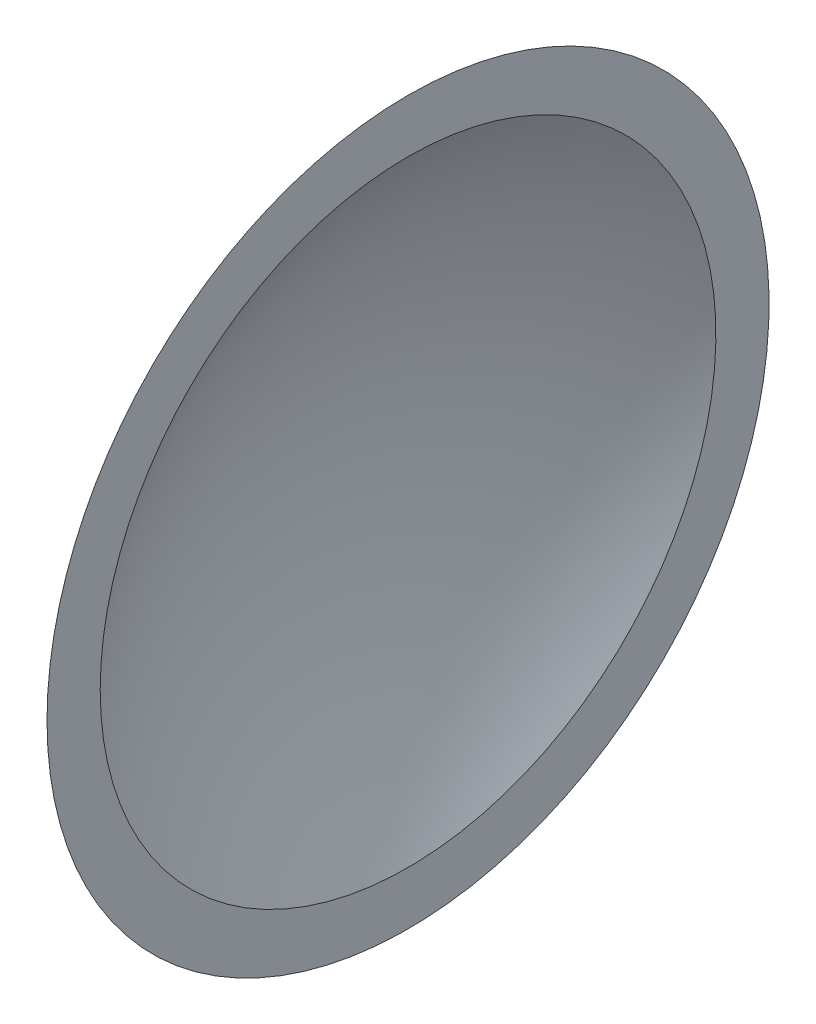
ISO-10303-21;
HEADER;
FILE_DESCRIPTION(('STEP AP214'),'2;1');
FILE_NAME('part.step','',(''),(''),'','','');
FILE_SCHEMA(('AUTOMOTIVE_DESIGN { 1 0 10303 214 1 1 1 1 }'));
ENDSEC;
DATA;
#1=APPLICATION_CONTEXT('core data for automotive mechanical design processes');
#2=APPLICATION_PROTOCOL_DEFINITION('international standard','automotive_design',2000,#1);
#3=PRODUCT_CONTEXT('',#1,'mechanical');
#4=PRODUCT('Part','Part','',(#3));
#5=PRODUCT_RELATED_PRODUCT_CATEGORY('part','',(#4));
#6=PRODUCT_DEFINITION_FORMATION('','',#4);
#7=PRODUCT_DEFINITION_CONTEXT('part definition',#1,'design');
#8=PRODUCT_DEFINITION('design','',#6,#7);
#9=PRODUCT_DEFINITION_SHAPE('','',#8);
#10=(LENGTH_UNIT() NAMED_UNIT(*) SI_UNIT(.MILLI.,.METRE.));
#11=(NAMED_UNIT(*) PLANE_ANGLE_UNIT() SI_UNIT($,.RADIAN.));
#12=(NAMED_UNIT(*) SI_UNIT($,.STERADIAN.) SOLID_ANGLE_UNIT());
#13=UNCERTAINTY_MEASURE_WITH_UNIT(LENGTH_MEASURE(1.E-05),#10,'distance_accuracy_value','');
#14=(GEOMETRIC_REPRESENTATION_CONTEXT(3) GLOBAL_UNCERTAINTY_ASSIGNED_CONTEXT((#13)) GLOBAL_UNIT_ASSIGNED_CONTEXT((#10,
#11,#12)) REPRESENTATION_CONTEXT('',''));
#15=CARTESIAN_POINT('',(0.,0.,0.));
#16=DIRECTION('',(0.,0.,1.));
#17=DIRECTION('',(1.,0.,0.));
#18=AXIS2_PLACEMENT_3D('',#15,#16,#17);
#19=CARTESIAN_POINT('',(-4.26330659143095,0.,0.));
#20=DIRECTION('',(-1.,0.,0.));
#21=DIRECTION('',(0.,0.,1.));
#22=AXIS2_PLACEMENT_3D('',#19,#20,#21);
#23=PLANE('',#22);
#24=CARTESIAN_POINT('',(-4.26330659143095,0.,0.));
#25=DIRECTION('',(-1.,0.,0.));
#26=DIRECTION('',(0.,0.,1.));
#27=AXIS2_PLACEMENT_3D('',#24,#25,#26);
#28=CIRCLE('',#27,3.06377494399661);
#29=CARTESIAN_POINT('',(-4.26330659143095,0.,3.06377494399661));
#30=VERTEX_POINT('',#29);
#31=EDGE_CURVE('E10',#30,#30,#28,.T.);
#32=ORIENTED_EDGE('',*,*,#31,.F.);
#33=EDGE_LOOP('',(#32));
#34=FACE_BOUND('',#33,.T.);
#35=CARTESIAN_POINT('',(-4.26330659143095,0.,0.));
#36=DIRECTION('',(-1.,0.,0.));
#37=DIRECTION('',(0.,0.,1.));
#38=AXIS2_PLACEMENT_3D('',#35,#36,#37);
#39=CIRCLE('',#38,2.61232021533759);
#40=CARTESIAN_POINT('',(-4.26330659143095,0.,2.61232021533759));
#41=VERTEX_POINT('',#40);
#42=EDGE_CURVE('E39',#41,#41,#39,.T.);
#43=ORIENTED_EDGE('',*,*,#42,.T.);
#44=EDGE_LOOP('',(#43));
#45=FACE_BOUND('',#44,.T.);
#46=ADVANCED_FACE('F33',(#34,#45),#23,.F.);
#47=CARTESIAN_POINT('',(0.,0.,0.));
#48=DIRECTION('',(-1.,0.,0.));
#49=DIRECTION('',(0.,1.,0.));
#50=AXIS2_PLACEMENT_3D('',#47,#48,#49);
#51=SPHERICAL_SURFACE('',#50,5.25);
#52=ORIENTED_EDGE('',*,*,#31,.T.);
#53=EDGE_LOOP('',(#52));
#54=FACE_BOUND('',#53,.T.);
#55=ADVANCED_FACE('F48',(#54),#51,.T.);
#56=CARTESIAN_POINT('',(0.,0.,0.));
#57=DIRECTION('',(-1.,0.,0.));
#58=DIRECTION('',(0.,1.,0.));
#59=AXIS2_PLACEMENT_3D('',#56,#57,#58);
#60=SPHERICAL_SURFACE('',#59,5.);
#61=ORIENTED_EDGE('',*,*,#42,.F.);
#62=EDGE_LOOP('',(#61));
#63=FACE_BOUND('',#62,.T.);
#64=ADVANCED_FACE('F46',(#63),#60,.F.);
#65=CLOSED_SHELL('',(#46,#55,#64));
#66=MANIFOLD_SOLID_BREP('B2',#65);
#67=ADVANCED_BREP_SHAPE_REPRESENTATION('',(#18,#66),#14);
#68=SHAPE_DEFINITION_REPRESENTATION(#9,#67);
ENDSEC;
END-ISO-10303-21;
